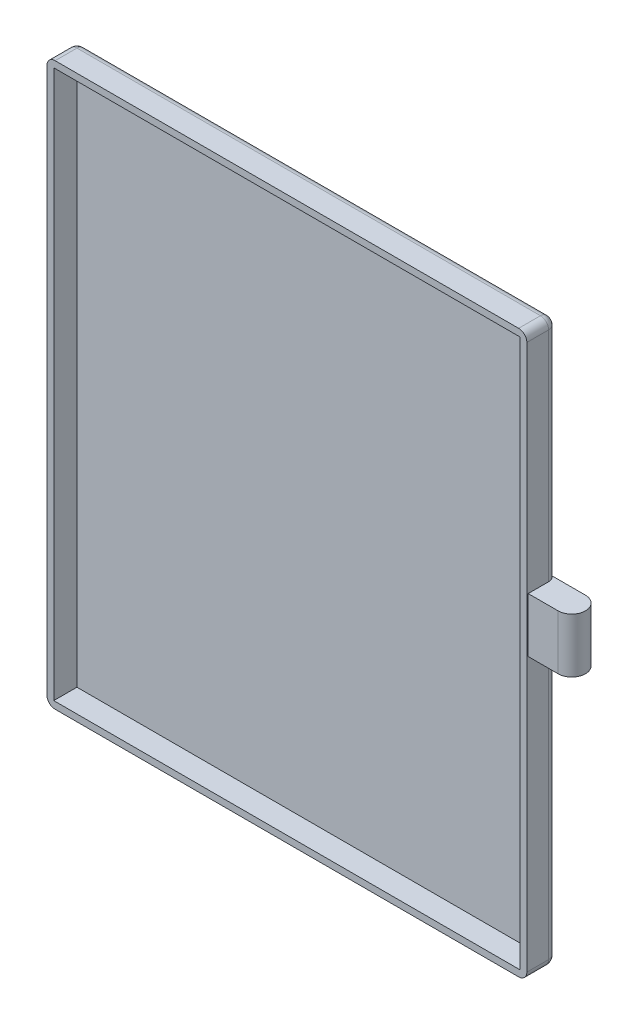
ISO-10303-21;
HEADER;
FILE_DESCRIPTION(('STEP AP214'),'2;1');
FILE_NAME('part.step','',(''),(''),'','','');
FILE_SCHEMA(('AUTOMOTIVE_DESIGN { 1 0 10303 214 1 1 1 1 }'));
ENDSEC;
DATA;
#1=APPLICATION_CONTEXT('core data for automotive mechanical design processes');
#2=APPLICATION_PROTOCOL_DEFINITION('international standard','automotive_design',2000,#1);
#3=PRODUCT_CONTEXT('',#1,'mechanical');
#4=PRODUCT('Part','Part','',(#3));
#5=PRODUCT_RELATED_PRODUCT_CATEGORY('part','',(#4));
#6=PRODUCT_DEFINITION_FORMATION('','',#4);
#7=PRODUCT_DEFINITION_CONTEXT('part definition',#1,'design');
#8=PRODUCT_DEFINITION('design','',#6,#7);
#9=PRODUCT_DEFINITION_SHAPE('','',#8);
#10=(LENGTH_UNIT() NAMED_UNIT(*) SI_UNIT(.MILLI.,.METRE.));
#11=(NAMED_UNIT(*) PLANE_ANGLE_UNIT() SI_UNIT($,.RADIAN.));
#12=(NAMED_UNIT(*) SI_UNIT($,.STERADIAN.) SOLID_ANGLE_UNIT());
#13=UNCERTAINTY_MEASURE_WITH_UNIT(LENGTH_MEASURE(1.E-05),#10,'distance_accuracy_value','');
#14=(GEOMETRIC_REPRESENTATION_CONTEXT(3) GLOBAL_UNCERTAINTY_ASSIGNED_CONTEXT((#13)) GLOBAL_UNIT_ASSIGNED_CONTEXT((#10,
#11,#12)) REPRESENTATION_CONTEXT('',''));
#15=CARTESIAN_POINT('',(0.,0.,0.));
#16=DIRECTION('',(0.,0.,1.));
#17=DIRECTION('',(1.,0.,0.));
#18=AXIS2_PLACEMENT_3D('',#15,#16,#17);
#19=CARTESIAN_POINT('',(49.5,0.,2.75));
#20=DIRECTION('',(0.,-1.,0.));
#21=DIRECTION('',(0.,0.,-1.));
#22=AXIS2_PLACEMENT_3D('',#19,#20,#21);
#23=CYLINDRICAL_SURFACE('',#22,2.5);
#24=DIRECTION('',(0.,1.,0.));
#25=VECTOR('',#24,1.);
#26=CARTESIAN_POINT('',(49.5,0.,5.25));
#27=LINE('',#26,#25);
#28=CARTESIAN_POINT('',(49.5,0.,5.25));
#29=VERTEX_POINT('',#28);
#30=CARTESIAN_POINT('',(49.5,10.,5.25));
#31=VERTEX_POINT('',#30);
#32=EDGE_CURVE('E217',#29,#31,#27,.T.);
#33=ORIENTED_EDGE('',*,*,#32,.F.);
#34=CARTESIAN_POINT('',(49.5,0.,2.75));
#35=DIRECTION('',(0.,1.,0.));
#36=DIRECTION('',(-1.,0.,0.));
#37=AXIS2_PLACEMENT_3D('',#34,#35,#36);
#38=CIRCLE('',#37,2.5);
#39=CARTESIAN_POINT('',(49.5,0.,0.25));
#40=VERTEX_POINT('',#39);
#41=EDGE_CURVE('E222',#40,#29,#38,.F.);
#42=ORIENTED_EDGE('',*,*,#41,.F.);
#43=DIRECTION('',(0.,1.,0.));
#44=VECTOR('',#43,1.);
#45=CARTESIAN_POINT('',(49.5,0.,0.25));
#46=LINE('',#45,#44);
#47=CARTESIAN_POINT('',(49.5,10.,0.250000000000001));
#48=VERTEX_POINT('',#47);
#49=EDGE_CURVE('E220',#48,#40,#46,.F.);
#50=ORIENTED_EDGE('',*,*,#49,.F.);
#51=CARTESIAN_POINT('',(49.5,10.,2.75));
#52=DIRECTION('',(0.,-1.,0.));
#53=DIRECTION('',(0.,0.,-1.));
#54=AXIS2_PLACEMENT_3D('',#51,#52,#53);
#55=CIRCLE('',#54,2.5);
#56=EDGE_CURVE('E224',#31,#48,#55,.F.);
#57=ORIENTED_EDGE('',*,*,#56,.F.);
#58=EDGE_LOOP('',(#33,#42,#50,#57));
#59=FACE_BOUND('',#58,.T.);
#60=ADVANCED_FACE('F35',(#59),#23,.T.);
#61=CARTESIAN_POINT('',(44.,51.5,5.5));
#62=DIRECTION('',(-1.,0.,0.));
#63=DIRECTION('',(0.,-1.,0.));
#64=AXIS2_PLACEMENT_3D('',#61,#62,#63);
#65=PLANE('',#64);
#66=DIRECTION('',(0.,1.,0.));
#67=VECTOR('',#66,1.);
#68=CARTESIAN_POINT('',(44.,51.5,5.5));
#69=LINE('',#68,#67);
#70=CARTESIAN_POINT('',(44.,-50.,5.5));
#71=VERTEX_POINT('',#70);
#72=CARTESIAN_POINT('',(44.,50.,5.5));
#73=VERTEX_POINT('',#72);
#74=EDGE_CURVE('E205',#71,#73,#69,.T.);
#75=ORIENTED_EDGE('',*,*,#74,.F.);
#76=DIRECTION('',(0.,0.,-1.));
#77=VECTOR('',#76,1.);
#78=CARTESIAN_POINT('',(44.,-50.,5.5));
#79=LINE('',#78,#77);
#80=CARTESIAN_POINT('',(44.,-50.,1.5));
#81=VERTEX_POINT('',#80);
#82=EDGE_CURVE('E239',#71,#81,#79,.T.);
#83=ORIENTED_EDGE('',*,*,#82,.T.);
#84=DIRECTION('',(0.,1.,0.));
#85=VECTOR('',#84,1.);
#86=CARTESIAN_POINT('',(44.,51.5,1.5));
#87=LINE('',#86,#85);
#88=CARTESIAN_POINT('',(44.,0.,1.5));
#89=VERTEX_POINT('',#88);
#90=EDGE_CURVE('E237',#81,#89,#87,.T.);
#91=ORIENTED_EDGE('',*,*,#90,.T.);
#92=DIRECTION('',(0.,0.,-1.));
#93=VECTOR('',#92,1.);
#94=CARTESIAN_POINT('',(44.,0.,5.25));
#95=LINE('',#94,#93);
#96=CARTESIAN_POINT('',(44.,0.,5.25));
#97=VERTEX_POINT('',#96);
#98=EDGE_CURVE('E325',#97,#89,#95,.T.);
#99=ORIENTED_EDGE('',*,*,#98,.F.);
#100=DIRECTION('',(0.,-1.,0.));
#101=VECTOR('',#100,1.);
#102=CARTESIAN_POINT('',(44.,10.,5.25));
#103=LINE('',#102,#101);
#104=CARTESIAN_POINT('',(44.,10.,5.25));
#105=VERTEX_POINT('',#104);
#106=EDGE_CURVE('E322',#105,#97,#103,.T.);
#107=ORIENTED_EDGE('',*,*,#106,.F.);
#108=DIRECTION('',(0.,0.,1.));
#109=VECTOR('',#108,1.);
#110=CARTESIAN_POINT('',(44.,10.,5.25));
#111=LINE('',#110,#109);
#112=CARTESIAN_POINT('',(44.,10.,1.5));
#113=VERTEX_POINT('',#112);
#114=EDGE_CURVE('E318',#113,#105,#111,.T.);
#115=ORIENTED_EDGE('',*,*,#114,.F.);
#116=DIRECTION('',(0.,1.,0.));
#117=VECTOR('',#116,1.);
#118=CARTESIAN_POINT('',(44.,51.5,1.5));
#119=LINE('',#118,#117);
#120=CARTESIAN_POINT('',(44.,50.,1.5));
#121=VERTEX_POINT('',#120);
#122=EDGE_CURVE('E233',#113,#121,#119,.T.);
#123=ORIENTED_EDGE('',*,*,#122,.T.);
#124=DIRECTION('',(0.,0.,-1.));
#125=VECTOR('',#124,1.);
#126=CARTESIAN_POINT('',(44.,50.,5.5));
#127=LINE('',#126,#125);
#128=EDGE_CURVE('E235',#121,#73,#127,.F.);
#129=ORIENTED_EDGE('',*,*,#128,.T.);
#130=EDGE_LOOP('',(#75,#83,#91,#99,#107,#115,#123,#129));
#131=FACE_BOUND('',#130,.T.);
#132=ADVANCED_FACE('F397',(#131),#65,.F.);
#133=CARTESIAN_POINT('',(-44.,51.5,5.5));
#134=DIRECTION('',(0.,-1.,0.));
#135=DIRECTION('',(0.,0.,-1.));
#136=AXIS2_PLACEMENT_3D('',#133,#134,#135);
#137=PLANE('',#136);
#138=DIRECTION('',(-1.,0.,0.));
#139=VECTOR('',#138,1.);
#140=CARTESIAN_POINT('',(-44.,51.5,5.5));
#141=LINE('',#140,#139);
#142=CARTESIAN_POINT('',(42.5,51.5,5.5));
#143=VERTEX_POINT('',#142);
#144=CARTESIAN_POINT('',(-42.5,51.5,5.5));
#145=VERTEX_POINT('',#144);
#146=EDGE_CURVE('E208',#143,#145,#141,.T.);
#147=ORIENTED_EDGE('',*,*,#146,.F.);
#148=DIRECTION('',(0.,0.,-1.));
#149=VECTOR('',#148,1.);
#150=CARTESIAN_POINT('',(42.5,51.5,5.5));
#151=LINE('',#150,#149);
#152=CARTESIAN_POINT('',(42.5,51.5,1.5));
#153=VERTEX_POINT('',#152);
#154=EDGE_CURVE('E230',#143,#153,#151,.T.);
#155=ORIENTED_EDGE('',*,*,#154,.T.);
#156=DIRECTION('',(-1.,0.,0.));
#157=VECTOR('',#156,1.);
#158=CARTESIAN_POINT('',(-44.,51.5,1.5));
#159=LINE('',#158,#157);
#160=CARTESIAN_POINT('',(-42.5,51.5,1.5));
#161=VERTEX_POINT('',#160);
#162=EDGE_CURVE('E226',#153,#161,#159,.T.);
#163=ORIENTED_EDGE('',*,*,#162,.T.);
#164=DIRECTION('',(0.,0.,-1.));
#165=VECTOR('',#164,1.);
#166=CARTESIAN_POINT('',(-42.5,51.5,5.5));
#167=LINE('',#166,#165);
#168=EDGE_CURVE('E228',#161,#145,#167,.F.);
#169=ORIENTED_EDGE('',*,*,#168,.T.);
#170=EDGE_LOOP('',(#147,#155,#163,#169));
#171=FACE_BOUND('',#170,.T.);
#172=ADVANCED_FACE('F364',(#171),#137,.F.);
#173=CARTESIAN_POINT('',(-44.,51.5,5.5));
#174=DIRECTION('',(1.,0.,0.));
#175=DIRECTION('',(0.,1.,0.));
#176=AXIS2_PLACEMENT_3D('',#173,#174,#175);
#177=PLANE('',#176);
#178=DIRECTION('',(0.,-1.,0.));
#179=VECTOR('',#178,1.);
#180=CARTESIAN_POINT('',(-44.,51.5,1.5));
#181=LINE('',#180,#179);
#182=CARTESIAN_POINT('',(-44.,50.,1.5));
#183=VERTEX_POINT('',#182);
#184=CARTESIAN_POINT('',(-44.,-50.,1.5));
#185=VERTEX_POINT('',#184);
#186=EDGE_CURVE('E255',#183,#185,#181,.T.);
#187=ORIENTED_EDGE('',*,*,#186,.T.);
#188=DIRECTION('',(0.,0.,-1.));
#189=VECTOR('',#188,1.);
#190=CARTESIAN_POINT('',(-44.,-50.,5.5));
#191=LINE('',#190,#189);
#192=CARTESIAN_POINT('',(-44.,-50.,5.5));
#193=VERTEX_POINT('',#192);
#194=EDGE_CURVE('E259',#185,#193,#191,.F.);
#195=ORIENTED_EDGE('',*,*,#194,.T.);
#196=DIRECTION('',(0.,-1.,0.));
#197=VECTOR('',#196,1.);
#198=CARTESIAN_POINT('',(-44.,51.5,5.5));
#199=LINE('',#198,#197);
#200=CARTESIAN_POINT('',(-44.,50.,5.5));
#201=VERTEX_POINT('',#200);
#202=EDGE_CURVE('E211',#201,#193,#199,.T.);
#203=ORIENTED_EDGE('',*,*,#202,.F.);
#204=DIRECTION('',(0.,0.,-1.));
#205=VECTOR('',#204,1.);
#206=CARTESIAN_POINT('',(-44.,50.,5.5));
#207=LINE('',#206,#205);
#208=EDGE_CURVE('E257',#201,#183,#207,.T.);
#209=ORIENTED_EDGE('',*,*,#208,.T.);
#210=EDGE_LOOP('',(#187,#195,#203,#209));
#211=FACE_BOUND('',#210,.T.);
#212=ADVANCED_FACE('F374',(#211),#177,.F.);
#213=CARTESIAN_POINT('',(-44.,-51.5,5.5));
#214=DIRECTION('',(0.,1.,0.));
#215=DIRECTION('',(0.,0.,1.));
#216=AXIS2_PLACEMENT_3D('',#213,#214,#215);
#217=PLANE('',#216);
#218=DIRECTION('',(1.,0.,0.));
#219=VECTOR('',#218,1.);
#220=CARTESIAN_POINT('',(-44.,-51.5,1.5));
#221=LINE('',#220,#219);
#222=CARTESIAN_POINT('',(-42.5,-51.5,1.5));
#223=VERTEX_POINT('',#222);
#224=CARTESIAN_POINT('',(42.5,-51.5,1.5));
#225=VERTEX_POINT('',#224);
#226=EDGE_CURVE('E249',#223,#225,#221,.T.);
#227=ORIENTED_EDGE('',*,*,#226,.T.);
#228=DIRECTION('',(0.,0.,-1.));
#229=VECTOR('',#228,1.);
#230=CARTESIAN_POINT('',(42.5,-51.5,5.5));
#231=LINE('',#230,#229);
#232=CARTESIAN_POINT('',(42.5,-51.5,5.5));
#233=VERTEX_POINT('',#232);
#234=EDGE_CURVE('E253',#225,#233,#231,.F.);
#235=ORIENTED_EDGE('',*,*,#234,.T.);
#236=DIRECTION('',(1.,0.,0.));
#237=VECTOR('',#236,1.);
#238=CARTESIAN_POINT('',(-44.,-51.5,5.5));
#239=LINE('',#238,#237);
#240=CARTESIAN_POINT('',(-42.5,-51.5,5.5));
#241=VERTEX_POINT('',#240);
#242=EDGE_CURVE('E214',#241,#233,#239,.T.);
#243=ORIENTED_EDGE('',*,*,#242,.F.);
#244=DIRECTION('',(0.,0.,-1.));
#245=VECTOR('',#244,1.);
#246=CARTESIAN_POINT('',(-42.5,-51.5,5.5));
#247=LINE('',#246,#245);
#248=EDGE_CURVE('E251',#241,#223,#247,.T.);
#249=ORIENTED_EDGE('',*,*,#248,.T.);
#250=EDGE_LOOP('',(#227,#235,#243,#249));
#251=FACE_BOUND('',#250,.T.);
#252=ADVANCED_FACE('F350',(#251),#217,.F.);
#253=CARTESIAN_POINT('',(0.,0.,5.5));
#254=DIRECTION('',(0.,0.,1.));
#255=DIRECTION('',(1.,0.,0.));
#256=AXIS2_PLACEMENT_3D('',#253,#254,#255);
#257=PLANE('',#256);
#258=DIRECTION('',(0.,1.,0.));
#259=VECTOR('',#258,1.);
#260=CARTESIAN_POINT('',(42.75,51.5,5.5));
#261=LINE('',#260,#259);
#262=CARTESIAN_POINT('',(42.75,-50.25,5.5));
#263=VERTEX_POINT('',#262);
#264=CARTESIAN_POINT('',(42.75,50.25,5.5));
#265=VERTEX_POINT('',#264);
#266=EDGE_CURVE('E194',#263,#265,#261,.T.);
#267=ORIENTED_EDGE('',*,*,#266,.F.);
#268=DIRECTION('',(1.,0.,0.));
#269=VECTOR('',#268,1.);
#270=CARTESIAN_POINT('',(-44.,-50.25,5.5));
#271=LINE('',#270,#269);
#272=CARTESIAN_POINT('',(-42.75,-50.25,5.5));
#273=VERTEX_POINT('',#272);
#274=EDGE_CURVE('E203',#273,#263,#271,.T.);
#275=ORIENTED_EDGE('',*,*,#274,.F.);
#276=DIRECTION('',(0.,-1.,0.));
#277=VECTOR('',#276,1.);
#278=CARTESIAN_POINT('',(-42.75,51.5,5.5));
#279=LINE('',#278,#277);
#280=CARTESIAN_POINT('',(-42.75,50.25,5.5));
#281=VERTEX_POINT('',#280);
#282=EDGE_CURVE('E201',#281,#273,#279,.T.);
#283=ORIENTED_EDGE('',*,*,#282,.F.);
#284=DIRECTION('',(-1.,0.,0.));
#285=VECTOR('',#284,1.);
#286=CARTESIAN_POINT('',(-44.,50.25,5.5));
#287=LINE('',#286,#285);
#288=EDGE_CURVE('E183',#265,#281,#287,.T.);
#289=ORIENTED_EDGE('',*,*,#288,.F.);
#290=EDGE_LOOP('',(#267,#275,#283,#289));
#291=FACE_BOUND('',#290,.T.);
#292=ORIENTED_EDGE('',*,*,#74,.T.);
#293=CARTESIAN_POINT('',(42.5,50.,5.5));
#294=DIRECTION('',(0.,0.,1.));
#295=DIRECTION('',(1.,0.,0.));
#296=AXIS2_PLACEMENT_3D('',#293,#294,#295);
#297=CIRCLE('',#296,1.5);
#298=EDGE_CURVE('E247',#73,#143,#297,.T.);
#299=ORIENTED_EDGE('',*,*,#298,.T.);
#300=ORIENTED_EDGE('',*,*,#146,.T.);
#301=CARTESIAN_POINT('',(-42.5,50.,5.5));
#302=DIRECTION('',(0.,0.,1.));
#303=DIRECTION('',(1.,0.,0.));
#304=AXIS2_PLACEMENT_3D('',#301,#302,#303);
#305=CIRCLE('',#304,1.5);
#306=EDGE_CURVE('E241',#145,#201,#305,.T.);
#307=ORIENTED_EDGE('',*,*,#306,.T.);
#308=ORIENTED_EDGE('',*,*,#202,.T.);
#309=CARTESIAN_POINT('',(-42.5,-50.,5.5));
#310=DIRECTION('',(0.,0.,1.));
#311=DIRECTION('',(1.,0.,0.));
#312=AXIS2_PLACEMENT_3D('',#309,#310,#311);
#313=CIRCLE('',#312,1.5);
#314=EDGE_CURVE('E243',#193,#241,#313,.T.);
#315=ORIENTED_EDGE('',*,*,#314,.T.);
#316=ORIENTED_EDGE('',*,*,#242,.T.);
#317=CARTESIAN_POINT('',(42.5,-50.,5.5));
#318=DIRECTION('',(0.,0.,1.));
#319=DIRECTION('',(1.,0.,0.));
#320=AXIS2_PLACEMENT_3D('',#317,#318,#319);
#321=CIRCLE('',#320,1.5);
#322=EDGE_CURVE('E245',#233,#71,#321,.T.);
#323=ORIENTED_EDGE('',*,*,#322,.T.);
#324=EDGE_LOOP('',(#292,#299,#300,#307,#308,#315,#316,#323));
#325=FACE_BOUND('',#324,.T.);
#326=ADVANCED_FACE('F346',(#291,#325),#257,.T.);
#327=CARTESIAN_POINT('',(0.,0.,0.));
#328=DIRECTION('',(0.,0.,1.));
#329=DIRECTION('',(1.,0.,0.));
#330=AXIS2_PLACEMENT_3D('',#327,#328,#329);
#331=PLANE('',#330);
#332=DIRECTION('',(1.,0.,0.));
#333=VECTOR('',#332,1.);
#334=CARTESIAN_POINT('',(0.,-50.,0.));
#335=LINE('',#334,#333);
#336=CARTESIAN_POINT('',(42.5,-50.,0.));
#337=VERTEX_POINT('',#336);
#338=CARTESIAN_POINT('',(-42.5,-50.,0.));
#339=VERTEX_POINT('',#338);
#340=EDGE_CURVE('E265',#337,#339,#335,.F.);
#341=ORIENTED_EDGE('',*,*,#340,.T.);
#342=DIRECTION('',(0.,-1.,0.));
#343=VECTOR('',#342,1.);
#344=CARTESIAN_POINT('',(-42.5,0.,0.));
#345=LINE('',#344,#343);
#346=CARTESIAN_POINT('',(-42.5,50.,0.));
#347=VERTEX_POINT('',#346);
#348=EDGE_CURVE('E267',#339,#347,#345,.F.);
#349=ORIENTED_EDGE('',*,*,#348,.T.);
#350=DIRECTION('',(-1.,0.,0.));
#351=VECTOR('',#350,1.);
#352=CARTESIAN_POINT('',(0.,50.,0.));
#353=LINE('',#352,#351);
#354=CARTESIAN_POINT('',(42.5,50.,0.));
#355=VERTEX_POINT('',#354);
#356=EDGE_CURVE('E261',#347,#355,#353,.F.);
#357=ORIENTED_EDGE('',*,*,#356,.T.);
#358=DIRECTION('',(0.,1.,0.));
#359=VECTOR('',#358,1.);
#360=CARTESIAN_POINT('',(42.5,0.,0.));
#361=LINE('',#360,#359);
#362=EDGE_CURVE('E263',#355,#337,#361,.F.);
#363=ORIENTED_EDGE('',*,*,#362,.T.);
#364=EDGE_LOOP('',(#341,#349,#357,#363));
#365=FACE_BOUND('',#364,.T.);
#366=ADVANCED_FACE('F349',(#365),#331,.F.);
#367=CARTESIAN_POINT('',(42.75,51.5,5.5));
#368=DIRECTION('',(-1.,0.,0.));
#369=DIRECTION('',(0.,-1.,0.));
#370=AXIS2_PLACEMENT_3D('',#367,#368,#369);
#371=PLANE('',#370);
#372=DIRECTION('',(0.,1.,0.));
#373=VECTOR('',#372,1.);
#374=CARTESIAN_POINT('',(42.75,51.5,1.25));
#375=LINE('',#374,#373);
#376=CARTESIAN_POINT('',(42.75,-50.25,1.25));
#377=VERTEX_POINT('',#376);
#378=CARTESIAN_POINT('',(42.75,50.25,1.25));
#379=VERTEX_POINT('',#378);
#380=EDGE_CURVE('E174',#377,#379,#375,.T.);
#381=ORIENTED_EDGE('',*,*,#380,.F.);
#382=DIRECTION('',(0.,0.,-1.));
#383=VECTOR('',#382,1.);
#384=CARTESIAN_POINT('',(42.75,-50.25,5.5));
#385=LINE('',#384,#383);
#386=EDGE_CURVE('E197',#263,#377,#385,.T.);
#387=ORIENTED_EDGE('',*,*,#386,.F.);
#388=ORIENTED_EDGE('',*,*,#266,.T.);
#389=DIRECTION('',(0.,0.,-1.));
#390=VECTOR('',#389,1.);
#391=CARTESIAN_POINT('',(42.75,50.25,5.5));
#392=LINE('',#391,#390);
#393=EDGE_CURVE('E187',#265,#379,#392,.T.);
#394=ORIENTED_EDGE('',*,*,#393,.T.);
#395=EDGE_LOOP('',(#381,#387,#388,#394));
#396=FACE_BOUND('',#395,.T.);
#397=ADVANCED_FACE('F344',(#396),#371,.T.);
#398=CARTESIAN_POINT('',(-44.,50.25,5.5));
#399=DIRECTION('',(0.,-1.,0.));
#400=DIRECTION('',(0.,0.,-1.));
#401=AXIS2_PLACEMENT_3D('',#398,#399,#400);
#402=PLANE('',#401);
#403=DIRECTION('',(-1.,0.,0.));
#404=VECTOR('',#403,1.);
#405=CARTESIAN_POINT('',(-44.,50.25,1.25));
#406=LINE('',#405,#404);
#407=CARTESIAN_POINT('',(-42.75,50.25,1.25));
#408=VERTEX_POINT('',#407);
#409=EDGE_CURVE('E167',#379,#408,#406,.T.);
#410=ORIENTED_EDGE('',*,*,#409,.F.);
#411=ORIENTED_EDGE('',*,*,#393,.F.);
#412=ORIENTED_EDGE('',*,*,#288,.T.);
#413=DIRECTION('',(0.,0.,-1.));
#414=VECTOR('',#413,1.);
#415=CARTESIAN_POINT('',(-42.75,50.25,5.5));
#416=LINE('',#415,#414);
#417=EDGE_CURVE('E180',#281,#408,#416,.T.);
#418=ORIENTED_EDGE('',*,*,#417,.T.);
#419=EDGE_LOOP('',(#410,#411,#412,#418));
#420=FACE_BOUND('',#419,.T.);
#421=ADVANCED_FACE('F181',(#420),#402,.T.);
#422=CARTESIAN_POINT('',(-42.75,51.5,5.5));
#423=DIRECTION('',(1.,0.,0.));
#424=DIRECTION('',(0.,1.,0.));
#425=AXIS2_PLACEMENT_3D('',#422,#423,#424);
#426=PLANE('',#425);
#427=DIRECTION('',(0.,-1.,0.));
#428=VECTOR('',#427,1.);
#429=CARTESIAN_POINT('',(-42.75,51.5,1.25));
#430=LINE('',#429,#428);
#431=CARTESIAN_POINT('',(-42.75,-50.25,1.25));
#432=VERTEX_POINT('',#431);
#433=EDGE_CURVE('E171',#408,#432,#430,.T.);
#434=ORIENTED_EDGE('',*,*,#433,.F.);
#435=ORIENTED_EDGE('',*,*,#417,.F.);
#436=ORIENTED_EDGE('',*,*,#282,.T.);
#437=DIRECTION('',(0.,0.,-1.));
#438=VECTOR('',#437,1.);
#439=CARTESIAN_POINT('',(-42.75,-50.25,5.5));
#440=LINE('',#439,#438);
#441=EDGE_CURVE('E188',#273,#432,#440,.T.);
#442=ORIENTED_EDGE('',*,*,#441,.T.);
#443=EDGE_LOOP('',(#434,#435,#436,#442));
#444=FACE_BOUND('',#443,.T.);
#445=ADVANCED_FACE('F190',(#444),#426,.T.);
#446=CARTESIAN_POINT('',(-44.,-50.25,5.5));
#447=DIRECTION('',(0.,1.,0.));
#448=DIRECTION('',(0.,0.,1.));
#449=AXIS2_PLACEMENT_3D('',#446,#447,#448);
#450=PLANE('',#449);
#451=DIRECTION('',(1.,0.,0.));
#452=VECTOR('',#451,1.);
#453=CARTESIAN_POINT('',(-44.,-50.25,1.25));
#454=LINE('',#453,#452);
#455=EDGE_CURVE('E192',#432,#377,#454,.T.);
#456=ORIENTED_EDGE('',*,*,#455,.F.);
#457=ORIENTED_EDGE('',*,*,#441,.F.);
#458=ORIENTED_EDGE('',*,*,#274,.T.);
#459=ORIENTED_EDGE('',*,*,#386,.T.);
#460=EDGE_LOOP('',(#456,#457,#458,#459));
#461=FACE_BOUND('',#460,.T.);
#462=ADVANCED_FACE('F340',(#461),#450,.T.);
#463=CARTESIAN_POINT('',(0.,0.,1.25));
#464=DIRECTION('',(0.,0.,1.));
#465=DIRECTION('',(1.,0.,0.));
#466=AXIS2_PLACEMENT_3D('',#463,#464,#465);
#467=PLANE('',#466);
#468=ORIENTED_EDGE('',*,*,#380,.T.);
#469=ORIENTED_EDGE('',*,*,#409,.T.);
#470=ORIENTED_EDGE('',*,*,#433,.T.);
#471=ORIENTED_EDGE('',*,*,#455,.T.);
#472=EDGE_LOOP('',(#468,#469,#470,#471));
#473=FACE_BOUND('',#472,.T.);
#474=ADVANCED_FACE('F169',(#473),#467,.T.);
#475=CARTESIAN_POINT('',(52.,10.,0.250000000000001));
#476=DIRECTION('',(0.,0.,1.));
#477=DIRECTION('',(0.,-1.,0.));
#478=AXIS2_PLACEMENT_3D('',#475,#476,#477);
#479=PLANE('',#478);
#480=DIRECTION('',(-1.,0.,0.));
#481=VECTOR('',#480,1.);
#482=CARTESIAN_POINT('',(52.,10.,0.250000000000001));
#483=LINE('',#482,#481);
#484=CARTESIAN_POINT('',(43.329156197589,10.,0.250000000000001));
#485=VERTEX_POINT('',#484);
#486=EDGE_CURVE('E51',#48,#485,#483,.T.);
#487=ORIENTED_EDGE('',*,*,#486,.F.);
#488=ORIENTED_EDGE('',*,*,#49,.T.);
#489=DIRECTION('',(-1.,0.,0.));
#490=VECTOR('',#489,1.);
#491=CARTESIAN_POINT('',(52.,0.,0.25));
#492=LINE('',#491,#490);
#493=CARTESIAN_POINT('',(43.329156197589,0.,0.25));
#494=VERTEX_POINT('',#493);
#495=EDGE_CURVE('E58',#40,#494,#492,.T.);
#496=ORIENTED_EDGE('',*,*,#495,.T.);
#497=DIRECTION('',(0.,1.,0.));
#498=VECTOR('',#497,1.);
#499=CARTESIAN_POINT('',(43.329156197589,0.,0.25));
#500=LINE('',#499,#498);
#501=EDGE_CURVE('E44',#494,#485,#500,.T.);
#502=ORIENTED_EDGE('',*,*,#501,.T.);
#503=EDGE_LOOP('',(#487,#488,#496,#502));
#504=FACE_BOUND('',#503,.T.);
#505=ADVANCED_FACE('F555',(#504),#479,.F.);
#506=CARTESIAN_POINT('',(52.,10.,5.25));
#507=DIRECTION('',(0.,-1.,0.));
#508=DIRECTION('',(0.,0.,-1.));
#509=AXIS2_PLACEMENT_3D('',#506,#507,#508);
#510=PLANE('',#509);
#511=DIRECTION('',(-1.,0.,0.));
#512=VECTOR('',#511,1.);
#513=CARTESIAN_POINT('',(52.,10.,5.25));
#514=LINE('',#513,#512);
#515=EDGE_CURVE('E331',#31,#105,#514,.T.);
#516=ORIENTED_EDGE('',*,*,#515,.F.);
#517=ORIENTED_EDGE('',*,*,#56,.T.);
#518=ORIENTED_EDGE('',*,*,#486,.T.);
#519=CARTESIAN_POINT('',(42.5,10.,1.5));
#520=DIRECTION('',(0.,-1.,0.));
#521=DIRECTION('',(0.,0.,-1.));
#522=AXIS2_PLACEMENT_3D('',#519,#520,#521);
#523=CIRCLE('',#522,1.5);
#524=EDGE_CURVE('E11',#485,#113,#523,.T.);
#525=ORIENTED_EDGE('',*,*,#524,.T.);
#526=ORIENTED_EDGE('',*,*,#114,.T.);
#527=EDGE_LOOP('',(#516,#517,#518,#525,#526));
#528=FACE_BOUND('',#527,.T.);
#529=ADVANCED_FACE('F546',(#528),#510,.F.);
#530=CARTESIAN_POINT('',(52.,10.,5.25));
#531=DIRECTION('',(0.,0.,-1.));
#532=DIRECTION('',(0.,1.,0.));
#533=AXIS2_PLACEMENT_3D('',#530,#531,#532);
#534=PLANE('',#533);
#535=DIRECTION('',(-1.,0.,0.));
#536=VECTOR('',#535,1.);
#537=CARTESIAN_POINT('',(52.,0.,5.25));
#538=LINE('',#537,#536);
#539=EDGE_CURVE('E329',#29,#97,#538,.T.);
#540=ORIENTED_EDGE('',*,*,#539,.F.);
#541=ORIENTED_EDGE('',*,*,#32,.T.);
#542=ORIENTED_EDGE('',*,*,#515,.T.);
#543=ORIENTED_EDGE('',*,*,#106,.T.);
#544=EDGE_LOOP('',(#540,#541,#542,#543));
#545=FACE_BOUND('',#544,.T.);
#546=ADVANCED_FACE('F538',(#545),#534,.F.);
#547=CARTESIAN_POINT('',(52.,0.,5.25));
#548=DIRECTION('',(0.,1.,0.));
#549=DIRECTION('',(-1.,0.,0.));
#550=AXIS2_PLACEMENT_3D('',#547,#548,#549);
#551=PLANE('',#550);
#552=CARTESIAN_POINT('',(49.5,0.,2.75));
#553=DIRECTION('',(0.,-1.,0.));
#554=DIRECTION('',(1.,0.,0.));
#555=AXIS2_PLACEMENT_3D('',#552,#553,#554);
#556=CIRCLE('',#555,1.5);
#557=CARTESIAN_POINT('',(51.,0.,2.75));
#558=VERTEX_POINT('',#557);
#559=EDGE_CURVE('E308',#558,#558,#556,.T.);
#560=ORIENTED_EDGE('',*,*,#559,.F.);
#561=EDGE_LOOP('',(#560));
#562=FACE_BOUND('',#561,.T.);
#563=ORIENTED_EDGE('',*,*,#495,.F.);
#564=ORIENTED_EDGE('',*,*,#41,.T.);
#565=ORIENTED_EDGE('',*,*,#539,.T.);
#566=ORIENTED_EDGE('',*,*,#98,.T.);
#567=CARTESIAN_POINT('',(42.5,0.,1.5));
#568=DIRECTION('',(0.,1.,0.));
#569=DIRECTION('',(-1.,0.,0.));
#570=AXIS2_PLACEMENT_3D('',#567,#568,#569);
#571=CIRCLE('',#570,1.5);
#572=EDGE_CURVE('E270',#89,#494,#571,.T.);
#573=ORIENTED_EDGE('',*,*,#572,.T.);
#574=EDGE_LOOP('',(#563,#564,#565,#566,#573));
#575=FACE_BOUND('',#574,.T.);
#576=ADVANCED_FACE('F524',(#562,#575),#551,.F.);
#577=CARTESIAN_POINT('',(49.5,3.00000000000001,2.75));
#578=DIRECTION('',(0.,-1.,0.));
#579=DIRECTION('',(1.,0.,0.));
#580=AXIS2_PLACEMENT_3D('',#577,#578,#579);
#581=CYLINDRICAL_SURFACE('',#580,1.5);
#582=CARTESIAN_POINT('',(49.5,3.00000000000001,2.75));
#583=DIRECTION('',(0.,-1.,0.));
#584=DIRECTION('',(1.,0.,0.));
#585=AXIS2_PLACEMENT_3D('',#582,#583,#584);
#586=CIRCLE('',#585,1.5);
#587=CARTESIAN_POINT('',(51.,3.00000000000001,2.75));
#588=VERTEX_POINT('',#587);
#589=EDGE_CURVE('E313',#588,#588,#586,.T.);
#590=ORIENTED_EDGE('',*,*,#589,.F.);
#591=EDGE_LOOP('',(#590));
#592=FACE_BOUND('',#591,.T.);
#593=ORIENTED_EDGE('',*,*,#559,.T.);
#594=EDGE_LOOP('',(#593));
#595=FACE_BOUND('',#594,.T.);
#596=ADVANCED_FACE('F515',(#592,#595),#581,.F.);
#597=CARTESIAN_POINT('',(49.5,3.00000000000001,2.75));
#598=DIRECTION('',(0.,-1.,0.));
#599=DIRECTION('',(1.,0.,0.));
#600=AXIS2_PLACEMENT_3D('',#597,#598,#599);
#601=PLANE('',#600);
#602=ORIENTED_EDGE('',*,*,#589,.T.);
#603=EDGE_LOOP('',(#602));
#604=FACE_BOUND('',#603,.T.);
#605=ADVANCED_FACE('F394',(#604),#601,.T.);
#606=CARTESIAN_POINT('',(-42.5,-50.,5.5));
#607=DIRECTION('',(0.,0.,-1.));
#608=DIRECTION('',(-1.,0.,0.));
#609=AXIS2_PLACEMENT_3D('',#606,#607,#608);
#610=CYLINDRICAL_SURFACE('',#609,1.5);
#611=CARTESIAN_POINT('',(-42.5,-50.,1.5));
#612=DIRECTION('',(0.,0.,-1.));
#613=DIRECTION('',(-1.,0.,0.));
#614=AXIS2_PLACEMENT_3D('',#611,#612,#613);
#615=CIRCLE('',#614,1.5);
#616=EDGE_CURVE('E39',#223,#185,#615,.T.);
#617=ORIENTED_EDGE('',*,*,#616,.F.);
#618=ORIENTED_EDGE('',*,*,#248,.F.);
#619=ORIENTED_EDGE('',*,*,#314,.F.);
#620=ORIENTED_EDGE('',*,*,#194,.F.);
#621=EDGE_LOOP('',(#617,#618,#619,#620));
#622=FACE_BOUND('',#621,.T.);
#623=ADVANCED_FACE('F37',(#622),#610,.T.);
#624=CARTESIAN_POINT('',(-42.5,-50.,1.5));
#625=DIRECTION('',(0.,0.,1.));
#626=DIRECTION('',(1.,0.,0.));
#627=AXIS2_PLACEMENT_3D('',#624,#625,#626);
#628=SPHERICAL_SURFACE('',#627,1.5);
#629=CARTESIAN_POINT('',(-42.5,-50.,1.5));
#630=DIRECTION('',(-1.,0.,0.));
#631=DIRECTION('',(0.,0.,1.));
#632=AXIS2_PLACEMENT_3D('',#629,#630,#631);
#633=CIRCLE('',#632,1.5);
#634=EDGE_CURVE('E299',#223,#339,#633,.F.);
#635=ORIENTED_EDGE('',*,*,#634,.F.);
#636=ORIENTED_EDGE('',*,*,#616,.T.);
#637=CARTESIAN_POINT('',(-42.5,-50.,1.5));
#638=DIRECTION('',(0.,-1.,0.));
#639=DIRECTION('',(0.,0.,-1.));
#640=AXIS2_PLACEMENT_3D('',#637,#638,#639);
#641=CIRCLE('',#640,1.5);
#642=EDGE_CURVE('E301',#339,#185,#641,.F.);
#643=ORIENTED_EDGE('',*,*,#642,.F.);
#644=EDGE_LOOP('',(#635,#636,#643));
#645=FACE_BOUND('',#644,.T.);
#646=ADVANCED_FACE('F387',(#645),#628,.T.);
#647=CARTESIAN_POINT('',(-42.5,50.,5.5));
#648=DIRECTION('',(0.,0.,-1.));
#649=DIRECTION('',(-1.,0.,0.));
#650=AXIS2_PLACEMENT_3D('',#647,#648,#649);
#651=CYLINDRICAL_SURFACE('',#650,1.5);
#652=ORIENTED_EDGE('',*,*,#306,.F.);
#653=ORIENTED_EDGE('',*,*,#168,.F.);
#654=CARTESIAN_POINT('',(-42.5,50.,1.5));
#655=DIRECTION('',(0.,0.,-1.));
#656=DIRECTION('',(-1.,0.,0.));
#657=AXIS2_PLACEMENT_3D('',#654,#655,#656);
#658=CIRCLE('',#657,1.5);
#659=EDGE_CURVE('E296',#183,#161,#658,.T.);
#660=ORIENTED_EDGE('',*,*,#659,.F.);
#661=ORIENTED_EDGE('',*,*,#208,.F.);
#662=EDGE_LOOP('',(#652,#653,#660,#661));
#663=FACE_BOUND('',#662,.T.);
#664=ADVANCED_FACE('F371',(#663),#651,.T.);
#665=CARTESIAN_POINT('',(-42.5,51.5,1.5));
#666=DIRECTION('',(0.,-1.,0.));
#667=DIRECTION('',(1.,0.,0.));
#668=AXIS2_PLACEMENT_3D('',#665,#666,#667);
#669=CYLINDRICAL_SURFACE('',#668,1.5);
#670=ORIENTED_EDGE('',*,*,#642,.T.);
#671=ORIENTED_EDGE('',*,*,#186,.F.);
#672=CARTESIAN_POINT('',(-42.5,50.,1.5));
#673=DIRECTION('',(0.,1.,0.));
#674=DIRECTION('',(0.,0.,1.));
#675=AXIS2_PLACEMENT_3D('',#672,#673,#674);
#676=CIRCLE('',#675,1.5);
#677=EDGE_CURVE('E293',#347,#183,#676,.T.);
#678=ORIENTED_EDGE('',*,*,#677,.F.);
#679=ORIENTED_EDGE('',*,*,#348,.F.);
#680=EDGE_LOOP('',(#670,#671,#678,#679));
#681=FACE_BOUND('',#680,.T.);
#682=ADVANCED_FACE('F377',(#681),#669,.T.);
#683=CARTESIAN_POINT('',(-44.,-50.,1.5));
#684=DIRECTION('',(1.,0.,0.));
#685=DIRECTION('',(0.,0.,-1.));
#686=AXIS2_PLACEMENT_3D('',#683,#684,#685);
#687=CYLINDRICAL_SURFACE('',#686,1.5);
#688=ORIENTED_EDGE('',*,*,#634,.T.);
#689=ORIENTED_EDGE('',*,*,#340,.F.);
#690=CARTESIAN_POINT('',(42.5,-50.,1.5));
#691=DIRECTION('',(1.,0.,0.));
#692=DIRECTION('',(0.,0.,-1.));
#693=AXIS2_PLACEMENT_3D('',#690,#691,#692);
#694=CIRCLE('',#693,1.5);
#695=EDGE_CURVE('E290',#225,#337,#694,.T.);
#696=ORIENTED_EDGE('',*,*,#695,.F.);
#697=ORIENTED_EDGE('',*,*,#226,.F.);
#698=EDGE_LOOP('',(#688,#689,#696,#697));
#699=FACE_BOUND('',#698,.T.);
#700=ADVANCED_FACE('F386',(#699),#687,.T.);
#701=CARTESIAN_POINT('',(42.5,-50.,5.5));
#702=DIRECTION('',(0.,0.,-1.));
#703=DIRECTION('',(-1.,0.,0.));
#704=AXIS2_PLACEMENT_3D('',#701,#702,#703);
#705=CYLINDRICAL_SURFACE('',#704,1.5);
#706=ORIENTED_EDGE('',*,*,#322,.F.);
#707=ORIENTED_EDGE('',*,*,#234,.F.);
#708=CARTESIAN_POINT('',(42.5,-50.,1.5));
#709=DIRECTION('',(0.,0.,-1.));
#710=DIRECTION('',(-1.,0.,0.));
#711=AXIS2_PLACEMENT_3D('',#708,#709,#710);
#712=CIRCLE('',#711,1.5);
#713=EDGE_CURVE('E287',#81,#225,#712,.T.);
#714=ORIENTED_EDGE('',*,*,#713,.F.);
#715=ORIENTED_EDGE('',*,*,#82,.F.);
#716=EDGE_LOOP('',(#706,#707,#714,#715));
#717=FACE_BOUND('',#716,.T.);
#718=ADVANCED_FACE('F432',(#717),#705,.T.);
#719=CARTESIAN_POINT('',(-42.5,50.,1.5));
#720=DIRECTION('',(0.,0.,1.));
#721=DIRECTION('',(1.,0.,0.));
#722=AXIS2_PLACEMENT_3D('',#719,#720,#721);
#723=SPHERICAL_SURFACE('',#722,1.5);
#724=ORIENTED_EDGE('',*,*,#677,.T.);
#725=ORIENTED_EDGE('',*,*,#659,.T.);
#726=CARTESIAN_POINT('',(-42.5,50.,1.5));
#727=DIRECTION('',(-1.,0.,0.));
#728=DIRECTION('',(0.,0.,1.));
#729=AXIS2_PLACEMENT_3D('',#726,#727,#728);
#730=CIRCLE('',#729,1.5);
#731=EDGE_CURVE('E284',#347,#161,#730,.F.);
#732=ORIENTED_EDGE('',*,*,#731,.F.);
#733=EDGE_LOOP('',(#724,#725,#732));
#734=FACE_BOUND('',#733,.T.);
#735=ADVANCED_FACE('F428',(#734),#723,.T.);
#736=CARTESIAN_POINT('',(42.5,-50.,1.5));
#737=DIRECTION('',(0.,0.,1.));
#738=DIRECTION('',(1.,0.,0.));
#739=AXIS2_PLACEMENT_3D('',#736,#737,#738);
#740=SPHERICAL_SURFACE('',#739,1.5);
#741=ORIENTED_EDGE('',*,*,#713,.T.);
#742=ORIENTED_EDGE('',*,*,#695,.T.);
#743=CARTESIAN_POINT('',(42.5,-50.,1.5));
#744=DIRECTION('',(0.,-1.,0.));
#745=DIRECTION('',(0.,0.,-1.));
#746=AXIS2_PLACEMENT_3D('',#743,#744,#745);
#747=CIRCLE('',#746,1.5);
#748=EDGE_CURVE('E281',#81,#337,#747,.F.);
#749=ORIENTED_EDGE('',*,*,#748,.F.);
#750=EDGE_LOOP('',(#741,#742,#749));
#751=FACE_BOUND('',#750,.T.);
#752=ADVANCED_FACE('F424',(#751),#740,.T.);
#753=CARTESIAN_POINT('',(-44.,50.,1.5));
#754=DIRECTION('',(-1.,0.,0.));
#755=DIRECTION('',(0.,0.,1.));
#756=AXIS2_PLACEMENT_3D('',#753,#754,#755);
#757=CYLINDRICAL_SURFACE('',#756,1.5);
#758=ORIENTED_EDGE('',*,*,#731,.T.);
#759=ORIENTED_EDGE('',*,*,#162,.F.);
#760=CARTESIAN_POINT('',(42.5,50.,1.5));
#761=DIRECTION('',(1.,0.,0.));
#762=DIRECTION('',(0.,0.,-1.));
#763=AXIS2_PLACEMENT_3D('',#760,#761,#762);
#764=CIRCLE('',#763,1.5);
#765=EDGE_CURVE('E278',#355,#153,#764,.T.);
#766=ORIENTED_EDGE('',*,*,#765,.F.);
#767=ORIENTED_EDGE('',*,*,#356,.F.);
#768=EDGE_LOOP('',(#758,#759,#766,#767));
#769=FACE_BOUND('',#768,.T.);
#770=ADVANCED_FACE('F420',(#769),#757,.T.);
#771=CARTESIAN_POINT('',(42.5,51.5,1.5));
#772=DIRECTION('',(0.,1.,0.));
#773=DIRECTION('',(-1.,0.,0.));
#774=AXIS2_PLACEMENT_3D('',#771,#772,#773);
#775=CYLINDRICAL_SURFACE('',#774,1.5);
#776=ORIENTED_EDGE('',*,*,#748,.T.);
#777=ORIENTED_EDGE('',*,*,#362,.F.);
#778=CARTESIAN_POINT('',(42.5,50.,1.5));
#779=DIRECTION('',(0.,1.,0.));
#780=DIRECTION('',(0.,0.,1.));
#781=AXIS2_PLACEMENT_3D('',#778,#779,#780);
#782=CIRCLE('',#781,1.5);
#783=EDGE_CURVE('E275',#121,#355,#782,.T.);
#784=ORIENTED_EDGE('',*,*,#783,.F.);
#785=ORIENTED_EDGE('',*,*,#122,.F.);
#786=ORIENTED_EDGE('',*,*,#524,.F.);
#787=ORIENTED_EDGE('',*,*,#501,.F.);
#788=ORIENTED_EDGE('',*,*,#572,.F.);
#789=ORIENTED_EDGE('',*,*,#90,.F.);
#790=EDGE_LOOP('',(#776,#777,#784,#785,#786,#787,#788,#789));
#791=FACE_BOUND('',#790,.T.);
#792=ADVANCED_FACE('F416',(#791),#775,.T.);
#793=CARTESIAN_POINT('',(42.5,50.,1.5));
#794=DIRECTION('',(0.,0.,1.));
#795=DIRECTION('',(1.,0.,0.));
#796=AXIS2_PLACEMENT_3D('',#793,#794,#795);
#797=SPHERICAL_SURFACE('',#796,1.5);
#798=ORIENTED_EDGE('',*,*,#783,.T.);
#799=ORIENTED_EDGE('',*,*,#765,.T.);
#800=CARTESIAN_POINT('',(42.5,50.,1.5));
#801=DIRECTION('',(0.,0.,-1.));
#802=DIRECTION('',(-1.,0.,0.));
#803=AXIS2_PLACEMENT_3D('',#800,#801,#802);
#804=CIRCLE('',#803,1.5);
#805=EDGE_CURVE('E273',#121,#153,#804,.F.);
#806=ORIENTED_EDGE('',*,*,#805,.F.);
#807=EDGE_LOOP('',(#798,#799,#806));
#808=FACE_BOUND('',#807,.T.);
#809=ADVANCED_FACE('F413',(#808),#797,.T.);
#810=CARTESIAN_POINT('',(42.5,50.,5.5));
#811=DIRECTION('',(0.,0.,-1.));
#812=DIRECTION('',(-1.,0.,0.));
#813=AXIS2_PLACEMENT_3D('',#810,#811,#812);
#814=CYLINDRICAL_SURFACE('',#813,1.5);
#815=ORIENTED_EDGE('',*,*,#298,.F.);
#816=ORIENTED_EDGE('',*,*,#128,.F.);
#817=ORIENTED_EDGE('',*,*,#805,.T.);
#818=ORIENTED_EDGE('',*,*,#154,.F.);
#819=EDGE_LOOP('',(#815,#816,#817,#818));
#820=FACE_BOUND('',#819,.T.);
#821=ADVANCED_FACE('F361',(#820),#814,.T.);
#822=CLOSED_SHELL('',(#60,#132,#172,#212,#252,#326,#366,#397,#421,#445,#462,#474,#505,#529,#546,
#576,#596,#605,#623,#646,#664,#682,#700,#718,#735,#752,#770,#792,#809,#821));
#823=MANIFOLD_SOLID_BREP('B2',#822);
#824=ADVANCED_BREP_SHAPE_REPRESENTATION('',(#18,#823),#14);
#825=SHAPE_DEFINITION_REPRESENTATION(#9,#824);
ENDSEC;
END-ISO-10303-21;
